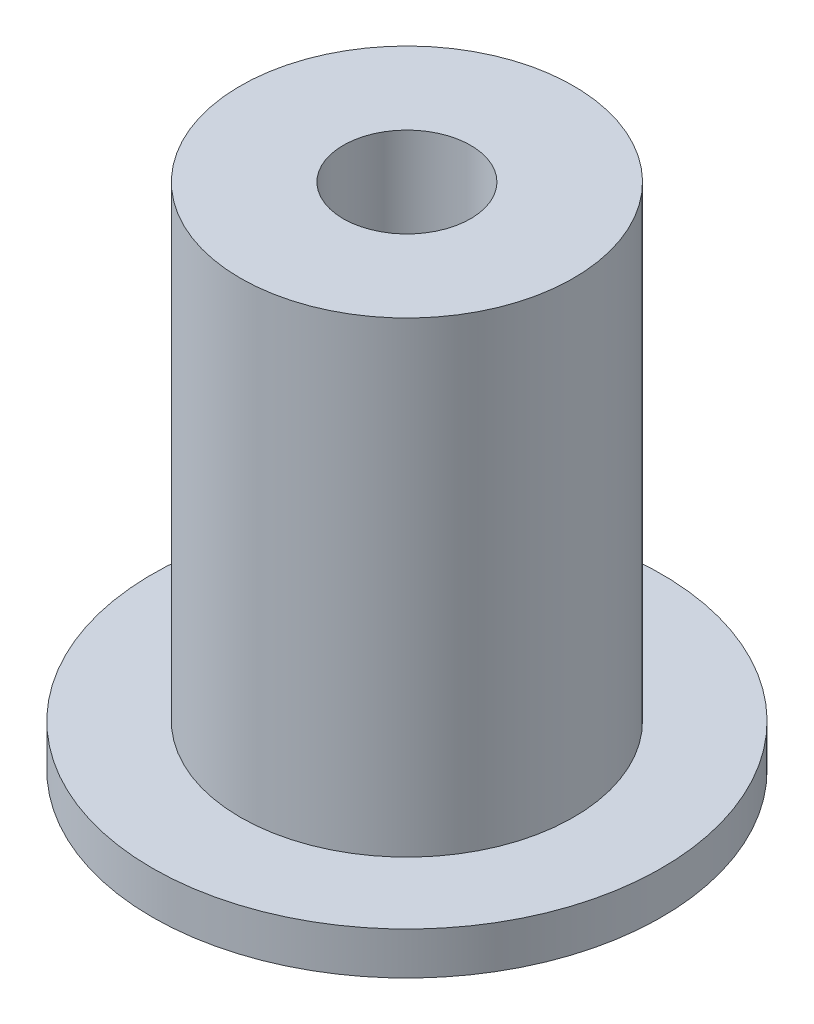
ISO-10303-21;
HEADER;
FILE_DESCRIPTION(('STEP AP214'),'2;1');
FILE_NAME('part.step','',(''),(''),'','','');
FILE_SCHEMA(('AUTOMOTIVE_DESIGN { 1 0 10303 214 1 1 1 1 }'));
ENDSEC;
DATA;
#1=APPLICATION_CONTEXT('core data for automotive mechanical design processes');
#2=APPLICATION_PROTOCOL_DEFINITION('international standard','automotive_design',2000,#1);
#3=PRODUCT_CONTEXT('',#1,'mechanical');
#4=PRODUCT('Part','Part','',(#3));
#5=PRODUCT_RELATED_PRODUCT_CATEGORY('part','',(#4));
#6=PRODUCT_DEFINITION_FORMATION('','',#4);
#7=PRODUCT_DEFINITION_CONTEXT('part definition',#1,'design');
#8=PRODUCT_DEFINITION('design','',#6,#7);
#9=PRODUCT_DEFINITION_SHAPE('','',#8);
#10=(LENGTH_UNIT() NAMED_UNIT(*) SI_UNIT(.MILLI.,.METRE.));
#11=(NAMED_UNIT(*) PLANE_ANGLE_UNIT() SI_UNIT($,.RADIAN.));
#12=(NAMED_UNIT(*) SI_UNIT($,.STERADIAN.) SOLID_ANGLE_UNIT());
#13=UNCERTAINTY_MEASURE_WITH_UNIT(LENGTH_MEASURE(1.E-05),#10,'distance_accuracy_value','');
#14=(GEOMETRIC_REPRESENTATION_CONTEXT(3) GLOBAL_UNCERTAINTY_ASSIGNED_CONTEXT((#13)) GLOBAL_UNIT_ASSIGNED_CONTEXT((#10,
#11,#12)) REPRESENTATION_CONTEXT('',''));
#15=CARTESIAN_POINT('',(0.,0.,0.));
#16=DIRECTION('',(0.,0.,1.));
#17=DIRECTION('',(1.,0.,0.));
#18=AXIS2_PLACEMENT_3D('',#15,#16,#17);
#19=CARTESIAN_POINT('',(0.,1.,0.));
#20=DIRECTION('',(0.,1.,0.));
#21=DIRECTION('',(0.,0.,1.));
#22=AXIS2_PLACEMENT_3D('',#19,#20,#21);
#23=PLANE('',#22);
#24=CARTESIAN_POINT('',(0.,1.,0.));
#25=DIRECTION('',(0.,1.,0.));
#26=DIRECTION('',(0.,0.,1.));
#27=AXIS2_PLACEMENT_3D('',#24,#25,#26);
#28=CIRCLE('',#27,6.);
#29=CARTESIAN_POINT('',(0.,1.,6.));
#30=VERTEX_POINT('',#29);
#31=EDGE_CURVE('E10',#30,#30,#28,.T.);
#32=ORIENTED_EDGE('',*,*,#31,.T.);
#33=EDGE_LOOP('',(#32));
#34=FACE_BOUND('',#33,.T.);
#35=CARTESIAN_POINT('',(0.,1.,0.));
#36=DIRECTION('',(0.,1.,0.));
#37=DIRECTION('',(0.,0.,1.));
#38=AXIS2_PLACEMENT_3D('',#35,#36,#37);
#39=CIRCLE('',#38,3.925);
#40=CARTESIAN_POINT('',(0.,1.,3.925));
#41=VERTEX_POINT('',#40);
#42=EDGE_CURVE('E55',#41,#41,#39,.T.);
#43=ORIENTED_EDGE('',*,*,#42,.F.);
#44=EDGE_LOOP('',(#43));
#45=FACE_BOUND('',#44,.T.);
#46=ADVANCED_FACE('F39',(#34,#45),#23,.T.);
#47=CARTESIAN_POINT('',(0.,0.,0.));
#48=DIRECTION('',(0.,1.,0.));
#49=DIRECTION('',(0.,0.,1.));
#50=AXIS2_PLACEMENT_3D('',#47,#48,#49);
#51=PLANE('',#50);
#52=CARTESIAN_POINT('',(0.,0.,0.));
#53=DIRECTION('',(0.,1.,0.));
#54=DIRECTION('',(0.,0.,1.));
#55=AXIS2_PLACEMENT_3D('',#52,#53,#54);
#56=CIRCLE('',#55,6.);
#57=CARTESIAN_POINT('',(0.,0.,6.));
#58=VERTEX_POINT('',#57);
#59=EDGE_CURVE('E43',#58,#58,#56,.T.);
#60=ORIENTED_EDGE('',*,*,#59,.F.);
#61=EDGE_LOOP('',(#60));
#62=FACE_BOUND('',#61,.T.);
#63=CARTESIAN_POINT('',(0.,0.,0.));
#64=DIRECTION('',(0.,1.,0.));
#65=DIRECTION('',(0.,0.,1.));
#66=AXIS2_PLACEMENT_3D('',#63,#64,#65);
#67=CIRCLE('',#66,1.5);
#68=CARTESIAN_POINT('',(0.,0.,1.5));
#69=VERTEX_POINT('',#68);
#70=EDGE_CURVE('E50',#69,#69,#67,.T.);
#71=ORIENTED_EDGE('',*,*,#70,.T.);
#72=EDGE_LOOP('',(#71));
#73=FACE_BOUND('',#72,.T.);
#74=ADVANCED_FACE('F80',(#62,#73),#51,.F.);
#75=CARTESIAN_POINT('',(0.,1.,0.));
#76=DIRECTION('',(0.,-1.,0.));
#77=DIRECTION('',(0.,0.,-1.));
#78=AXIS2_PLACEMENT_3D('',#75,#76,#77);
#79=CYLINDRICAL_SURFACE('',#78,6.);
#80=ORIENTED_EDGE('',*,*,#31,.F.);
#81=EDGE_LOOP('',(#80));
#82=FACE_BOUND('',#81,.T.);
#83=ORIENTED_EDGE('',*,*,#59,.T.);
#84=EDGE_LOOP('',(#83));
#85=FACE_BOUND('',#84,.T.);
#86=ADVANCED_FACE('F41',(#82,#85),#79,.T.);
#87=CARTESIAN_POINT('',(0.,1.,0.));
#88=DIRECTION('',(0.,-1.,0.));
#89=DIRECTION('',(0.,0.,-1.));
#90=AXIS2_PLACEMENT_3D('',#87,#88,#89);
#91=CYLINDRICAL_SURFACE('',#90,1.5);
#92=ORIENTED_EDGE('',*,*,#70,.F.);
#93=EDGE_LOOP('',(#92));
#94=FACE_BOUND('',#93,.T.);
#95=CARTESIAN_POINT('',(0.,12.,0.));
#96=DIRECTION('',(0.,1.,0.));
#97=DIRECTION('',(0.,0.,1.));
#98=AXIS2_PLACEMENT_3D('',#95,#96,#97);
#99=CIRCLE('',#98,1.5);
#100=CARTESIAN_POINT('',(0.,12.,1.5));
#101=VERTEX_POINT('',#100);
#102=EDGE_CURVE('E58',#101,#101,#99,.T.);
#103=ORIENTED_EDGE('',*,*,#102,.T.);
#104=EDGE_LOOP('',(#103));
#105=FACE_BOUND('',#104,.T.);
#106=ADVANCED_FACE('F64',(#94,#105),#91,.F.);
#107=CARTESIAN_POINT('',(0.,12.,0.));
#108=DIRECTION('',(0.,1.,0.));
#109=DIRECTION('',(0.,0.,1.));
#110=AXIS2_PLACEMENT_3D('',#107,#108,#109);
#111=PLANE('',#110);
#112=CARTESIAN_POINT('',(0.,12.,0.));
#113=DIRECTION('',(0.,1.,0.));
#114=DIRECTION('',(0.,0.,1.));
#115=AXIS2_PLACEMENT_3D('',#112,#113,#114);
#116=CIRCLE('',#115,3.925);
#117=CARTESIAN_POINT('',(0.,12.,3.925));
#118=VERTEX_POINT('',#117);
#119=EDGE_CURVE('E54',#118,#118,#116,.T.);
#120=ORIENTED_EDGE('',*,*,#119,.T.);
#121=EDGE_LOOP('',(#120));
#122=FACE_BOUND('',#121,.T.);
#123=ORIENTED_EDGE('',*,*,#102,.F.);
#124=EDGE_LOOP('',(#123));
#125=FACE_BOUND('',#124,.T.);
#126=ADVANCED_FACE('F66',(#122,#125),#111,.T.);
#127=CARTESIAN_POINT('',(0.,12.,0.));
#128=DIRECTION('',(0.,-1.,0.));
#129=DIRECTION('',(0.,0.,-1.));
#130=AXIS2_PLACEMENT_3D('',#127,#128,#129);
#131=CYLINDRICAL_SURFACE('',#130,3.925);
#132=ORIENTED_EDGE('',*,*,#119,.F.);
#133=EDGE_LOOP('',(#132));
#134=FACE_BOUND('',#133,.T.);
#135=ORIENTED_EDGE('',*,*,#42,.T.);
#136=EDGE_LOOP('',(#135));
#137=FACE_BOUND('',#136,.T.);
#138=ADVANCED_FACE('F68',(#134,#137),#131,.T.);
#139=CLOSED_SHELL('',(#46,#74,#86,#106,#126,#138));
#140=MANIFOLD_SOLID_BREP('B2',#139);
#141=ADVANCED_BREP_SHAPE_REPRESENTATION('',(#18,#140),#14);
#142=SHAPE_DEFINITION_REPRESENTATION(#9,#141);
ENDSEC;
END-ISO-10303-21;
